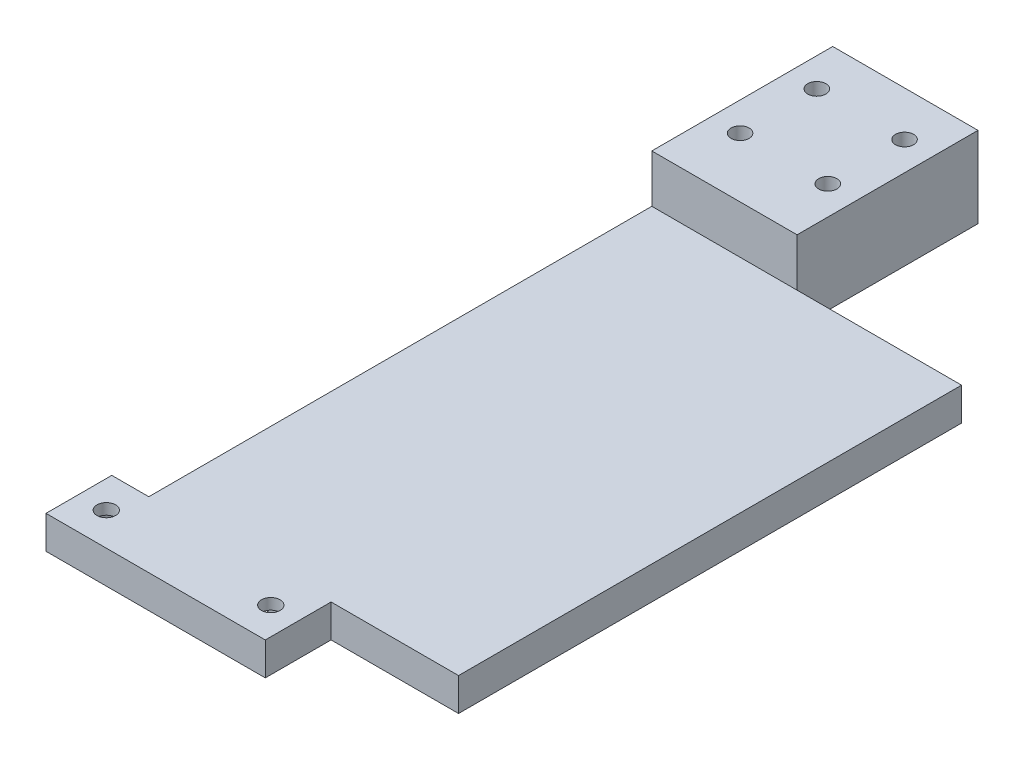
ISO-10303-21;
HEADER;
FILE_DESCRIPTION(('STEP AP214'),'2;1');
FILE_NAME('part.step','',(''),(''),'','','');
FILE_SCHEMA(('AUTOMOTIVE_DESIGN { 1 0 10303 214 1 1 1 1 }'));
ENDSEC;
DATA;
#1=APPLICATION_CONTEXT('core data for automotive mechanical design processes');
#2=APPLICATION_PROTOCOL_DEFINITION('international standard','automotive_design',2000,#1);
#3=PRODUCT_CONTEXT('',#1,'mechanical');
#4=PRODUCT('Part','Part','',(#3));
#5=PRODUCT_RELATED_PRODUCT_CATEGORY('part','',(#4));
#6=PRODUCT_DEFINITION_FORMATION('','',#4);
#7=PRODUCT_DEFINITION_CONTEXT('part definition',#1,'design');
#8=PRODUCT_DEFINITION('design','',#6,#7);
#9=PRODUCT_DEFINITION_SHAPE('','',#8);
#10=(LENGTH_UNIT() NAMED_UNIT(*) SI_UNIT(.MILLI.,.METRE.));
#11=(NAMED_UNIT(*) PLANE_ANGLE_UNIT() SI_UNIT($,.RADIAN.));
#12=(NAMED_UNIT(*) SI_UNIT($,.STERADIAN.) SOLID_ANGLE_UNIT());
#13=UNCERTAINTY_MEASURE_WITH_UNIT(LENGTH_MEASURE(1.E-05),#10,'distance_accuracy_value','');
#14=(GEOMETRIC_REPRESENTATION_CONTEXT(3) GLOBAL_UNCERTAINTY_ASSIGNED_CONTEXT((#13)) GLOBAL_UNIT_ASSIGNED_CONTEXT((#10,
#11,#12)) REPRESENTATION_CONTEXT('',''));
#15=CARTESIAN_POINT('',(0.,0.,0.));
#16=DIRECTION('',(0.,0.,1.));
#17=DIRECTION('',(1.,0.,0.));
#18=AXIS2_PLACEMENT_3D('',#15,#16,#17);
#19=CARTESIAN_POINT('',(13.25,14.75,-3.3));
#20=DIRECTION('',(-1.,0.,0.));
#21=DIRECTION('',(0.,0.,1.));
#22=AXIS2_PLACEMENT_3D('',#19,#20,#21);
#23=PLANE('',#22);
#24=DIRECTION('',(0.,1.,0.));
#25=VECTOR('',#24,1.);
#26=CARTESIAN_POINT('',(13.25,6.,0.));
#27=LINE('',#26,#25);
#28=CARTESIAN_POINT('',(13.25,0.,0.));
#29=VERTEX_POINT('',#28);
#30=CARTESIAN_POINT('',(13.25,6.,0.));
#31=VERTEX_POINT('',#30);
#32=EDGE_CURVE('E56',#29,#31,#27,.T.);
#33=ORIENTED_EDGE('',*,*,#32,.F.);
#34=DIRECTION('',(0.,0.,-1.));
#35=VECTOR('',#34,1.);
#36=CARTESIAN_POINT('',(13.25,0.,-3.3));
#37=LINE('',#36,#35);
#38=CARTESIAN_POINT('',(13.25,0.,-33.));
#39=VERTEX_POINT('',#38);
#40=EDGE_CURVE('E341',#29,#39,#37,.T.);
#41=ORIENTED_EDGE('',*,*,#40,.T.);
#42=DIRECTION('',(0.,-1.,0.));
#43=VECTOR('',#42,1.);
#44=CARTESIAN_POINT('',(13.25,14.75,-33.));
#45=LINE('',#44,#43);
#46=CARTESIAN_POINT('',(13.25,14.75,-33.));
#47=VERTEX_POINT('',#46);
#48=EDGE_CURVE('E347',#47,#39,#45,.T.);
#49=ORIENTED_EDGE('',*,*,#48,.F.);
#50=DIRECTION('',(0.,0.,-1.));
#51=VECTOR('',#50,1.);
#52=CARTESIAN_POINT('',(13.25,14.75,-3.3));
#53=LINE('',#52,#51);
#54=CARTESIAN_POINT('',(13.25,14.75,0.));
#55=VERTEX_POINT('',#54);
#56=EDGE_CURVE('E345',#55,#47,#53,.T.);
#57=ORIENTED_EDGE('',*,*,#56,.F.);
#58=DIRECTION('',(0.,-1.,0.));
#59=VECTOR('',#58,1.);
#60=CARTESIAN_POINT('',(13.25,14.75,0.));
#61=LINE('',#60,#59);
#62=EDGE_CURVE('E355',#55,#31,#61,.T.);
#63=ORIENTED_EDGE('',*,*,#62,.T.);
#64=EDGE_LOOP('',(#33,#41,#49,#57,#63));
#65=FACE_BOUND('',#64,.T.);
#66=ADVANCED_FACE('F39',(#65),#23,.F.);
#67=CARTESIAN_POINT('',(15.0000000000001,0.,97.7499999999999));
#68=DIRECTION('',(0.,1.,0.));
#69=DIRECTION('',(0.,0.,1.));
#70=AXIS2_PLACEMENT_3D('',#67,#68,#69);
#71=CYLINDRICAL_SURFACE('',#70,1.70000000000001);
#72=CARTESIAN_POINT('',(15.0000000000001,6.,97.7499999999999));
#73=DIRECTION('',(0.,1.,0.));
#74=DIRECTION('',(0.,0.,1.));
#75=AXIS2_PLACEMENT_3D('',#72,#73,#74);
#76=CIRCLE('',#75,1.70000000000001);
#77=CARTESIAN_POINT('',(15.0000000000001,6.,99.45));
#78=VERTEX_POINT('',#77);
#79=EDGE_CURVE('E282',#78,#78,#76,.T.);
#80=ORIENTED_EDGE('',*,*,#79,.T.);
#81=EDGE_LOOP('',(#80));
#82=FACE_BOUND('',#81,.T.);
#83=CARTESIAN_POINT('',(15.0000000000001,4.,97.7499999999999));
#84=DIRECTION('',(0.,-1.,0.));
#85=DIRECTION('',(0.,0.,-1.));
#86=AXIS2_PLACEMENT_3D('',#83,#84,#85);
#87=CIRCLE('',#86,1.70000000000001);
#88=CARTESIAN_POINT('',(15.0000000000001,4.,96.0499999999999));
#89=VERTEX_POINT('',#88);
#90=EDGE_CURVE('E237',#89,#89,#87,.F.);
#91=ORIENTED_EDGE('',*,*,#90,.F.);
#92=EDGE_LOOP('',(#91));
#93=FACE_BOUND('',#92,.T.);
#94=ADVANCED_FACE('F390',(#82,#93),#71,.F.);
#95=CARTESIAN_POINT('',(-14.9999999999999,0.,97.7499999999999));
#96=DIRECTION('',(0.,1.,0.));
#97=DIRECTION('',(0.,0.,1.));
#98=AXIS2_PLACEMENT_3D('',#95,#96,#97);
#99=CYLINDRICAL_SURFACE('',#98,1.70000000000001);
#100=CARTESIAN_POINT('',(-14.9999999999999,6.,97.7499999999999));
#101=DIRECTION('',(0.,1.,0.));
#102=DIRECTION('',(0.,0.,1.));
#103=AXIS2_PLACEMENT_3D('',#100,#101,#102);
#104=CIRCLE('',#103,1.70000000000001);
#105=CARTESIAN_POINT('',(-14.9999999999999,6.,99.45));
#106=VERTEX_POINT('',#105);
#107=EDGE_CURVE('E283',#106,#106,#104,.T.);
#108=ORIENTED_EDGE('',*,*,#107,.T.);
#109=EDGE_LOOP('',(#108));
#110=FACE_BOUND('',#109,.T.);
#111=CARTESIAN_POINT('',(-14.9999999999999,4.,97.7499999999999));
#112=DIRECTION('',(0.,-1.,0.));
#113=DIRECTION('',(0.,0.,-1.));
#114=AXIS2_PLACEMENT_3D('',#111,#112,#113);
#115=CIRCLE('',#114,1.70000000000001);
#116=CARTESIAN_POINT('',(-14.9999999999999,4.,96.0499999999999));
#117=VERTEX_POINT('',#116);
#118=EDGE_CURVE('E43',#117,#117,#115,.F.);
#119=ORIENTED_EDGE('',*,*,#118,.F.);
#120=EDGE_LOOP('',(#119));
#121=FACE_BOUND('',#120,.T.);
#122=ADVANCED_FACE('F396',(#110,#121),#99,.F.);
#123=CARTESIAN_POINT('',(-13.25,14.75,-3.3));
#124=DIRECTION('',(1.,0.,0.));
#125=DIRECTION('',(0.,0.,-1.));
#126=AXIS2_PLACEMENT_3D('',#123,#124,#125);
#127=PLANE('',#126);
#128=DIRECTION('',(0.,-1.,0.));
#129=VECTOR('',#128,1.);
#130=CARTESIAN_POINT('',(-13.2499999999999,14.75,91.75));
#131=LINE('',#130,#129);
#132=CARTESIAN_POINT('',(-13.25,6.,91.75));
#133=VERTEX_POINT('',#132);
#134=CARTESIAN_POINT('',(-13.2499999999999,0.,91.75));
#135=VERTEX_POINT('',#134);
#136=EDGE_CURVE('E312',#133,#135,#131,.T.);
#137=ORIENTED_EDGE('',*,*,#136,.F.);
#138=DIRECTION('',(0.,0.,-1.));
#139=VECTOR('',#138,1.);
#140=CARTESIAN_POINT('',(-13.25,6.,103.75));
#141=LINE('',#140,#139);
#142=CARTESIAN_POINT('',(-13.25,6.,0.));
#143=VERTEX_POINT('',#142);
#144=EDGE_CURVE('E320',#133,#143,#141,.T.);
#145=ORIENTED_EDGE('',*,*,#144,.T.);
#146=DIRECTION('',(0.,-1.,0.));
#147=VECTOR('',#146,1.);
#148=CARTESIAN_POINT('',(-13.25,14.75,0.));
#149=LINE('',#148,#147);
#150=CARTESIAN_POINT('',(-13.25,14.75,0.));
#151=VERTEX_POINT('',#150);
#152=EDGE_CURVE('E48',#151,#143,#149,.T.);
#153=ORIENTED_EDGE('',*,*,#152,.F.);
#154=DIRECTION('',(0.,0.,1.));
#155=VECTOR('',#154,1.);
#156=CARTESIAN_POINT('',(-13.25,14.75,-33.));
#157=LINE('',#156,#155);
#158=CARTESIAN_POINT('',(-13.25,14.75,-33.));
#159=VERTEX_POINT('',#158);
#160=EDGE_CURVE('E340',#159,#151,#157,.T.);
#161=ORIENTED_EDGE('',*,*,#160,.F.);
#162=DIRECTION('',(0.,-1.,0.));
#163=VECTOR('',#162,1.);
#164=CARTESIAN_POINT('',(-13.25,14.75,-33.));
#165=LINE('',#164,#163);
#166=CARTESIAN_POINT('',(-13.25,0.,-33.));
#167=VERTEX_POINT('',#166);
#168=EDGE_CURVE('E11',#159,#167,#165,.T.);
#169=ORIENTED_EDGE('',*,*,#168,.T.);
#170=DIRECTION('',(0.,0.,1.));
#171=VECTOR('',#170,1.);
#172=CARTESIAN_POINT('',(-13.25,0.,-3.3));
#173=LINE('',#172,#171);
#174=EDGE_CURVE('E350',#167,#135,#173,.T.);
#175=ORIENTED_EDGE('',*,*,#174,.T.);
#176=EDGE_LOOP('',(#137,#145,#153,#161,#169,#175));
#177=FACE_BOUND('',#176,.T.);
#178=ADVANCED_FACE('F383',(#177),#127,.F.);
#179=CARTESIAN_POINT('',(-13.25,14.75,0.));
#180=DIRECTION('',(0.,0.,-1.));
#181=DIRECTION('',(-1.,0.,0.));
#182=AXIS2_PLACEMENT_3D('',#179,#180,#181);
#183=PLANE('',#182);
#184=DIRECTION('',(-1.,0.,0.));
#185=VECTOR('',#184,1.);
#186=CARTESIAN_POINT('',(-13.25,6.,0.));
#187=LINE('',#186,#185);
#188=EDGE_CURVE('E315',#31,#143,#187,.T.);
#189=ORIENTED_EDGE('',*,*,#188,.F.);
#190=ORIENTED_EDGE('',*,*,#62,.F.);
#191=DIRECTION('',(1.,0.,0.));
#192=VECTOR('',#191,1.);
#193=CARTESIAN_POINT('',(-13.25,14.75,0.));
#194=LINE('',#193,#192);
#195=EDGE_CURVE('E343',#151,#55,#194,.T.);
#196=ORIENTED_EDGE('',*,*,#195,.F.);
#197=ORIENTED_EDGE('',*,*,#152,.T.);
#198=EDGE_LOOP('',(#189,#190,#196,#197));
#199=FACE_BOUND('',#198,.T.);
#200=ADVANCED_FACE('F374',(#199),#183,.F.);
#201=CARTESIAN_POINT('',(0.,14.75,0.));
#202=DIRECTION('',(0.,1.,0.));
#203=DIRECTION('',(0.,0.,1.));
#204=AXIS2_PLACEMENT_3D('',#201,#202,#203);
#205=PLANE('',#204);
#206=CARTESIAN_POINT('',(-8.00000000000001,14.75,-24.85));
#207=DIRECTION('',(0.,1.,0.));
#208=DIRECTION('',(0.,0.,1.));
#209=AXIS2_PLACEMENT_3D('',#206,#207,#208);
#210=CIRCLE('',#209,1.65);
#211=CARTESIAN_POINT('',(-8.00000000000001,14.75,-23.2));
#212=VERTEX_POINT('',#211);
#213=EDGE_CURVE('E327',#212,#212,#210,.T.);
#214=ORIENTED_EDGE('',*,*,#213,.F.);
#215=EDGE_LOOP('',(#214));
#216=FACE_BOUND('',#215,.T.);
#217=CARTESIAN_POINT('',(7.99999999999999,14.75,-10.85));
#218=DIRECTION('',(0.,1.,0.));
#219=DIRECTION('',(0.,0.,1.));
#220=AXIS2_PLACEMENT_3D('',#217,#218,#219);
#221=CIRCLE('',#220,1.65);
#222=CARTESIAN_POINT('',(7.99999999999999,14.75,-9.2));
#223=VERTEX_POINT('',#222);
#224=EDGE_CURVE('E333',#223,#223,#221,.T.);
#225=ORIENTED_EDGE('',*,*,#224,.F.);
#226=EDGE_LOOP('',(#225));
#227=FACE_BOUND('',#226,.T.);
#228=DIRECTION('',(-1.,0.,0.));
#229=VECTOR('',#228,1.);
#230=CARTESIAN_POINT('',(13.25,14.75,-33.));
#231=LINE('',#230,#229);
#232=EDGE_CURVE('E337',#47,#159,#231,.T.);
#233=ORIENTED_EDGE('',*,*,#232,.T.);
#234=ORIENTED_EDGE('',*,*,#160,.T.);
#235=ORIENTED_EDGE('',*,*,#195,.T.);
#236=ORIENTED_EDGE('',*,*,#56,.T.);
#237=EDGE_LOOP('',(#233,#234,#235,#236));
#238=FACE_BOUND('',#237,.T.);
#239=CARTESIAN_POINT('',(7.99999999999999,14.75,-24.85));
#240=DIRECTION('',(0.,1.,0.));
#241=DIRECTION('',(0.,0.,1.));
#242=AXIS2_PLACEMENT_3D('',#239,#240,#241);
#243=CIRCLE('',#242,1.65);
#244=CARTESIAN_POINT('',(7.99999999999999,14.75,-23.2));
#245=VERTEX_POINT('',#244);
#246=EDGE_CURVE('E330',#245,#245,#243,.T.);
#247=ORIENTED_EDGE('',*,*,#246,.F.);
#248=EDGE_LOOP('',(#247));
#249=FACE_BOUND('',#248,.T.);
#250=CARTESIAN_POINT('',(-8.00000000000001,14.75,-10.85));
#251=DIRECTION('',(0.,1.,0.));
#252=DIRECTION('',(0.,0.,1.));
#253=AXIS2_PLACEMENT_3D('',#250,#251,#252);
#254=CIRCLE('',#253,1.65);
#255=CARTESIAN_POINT('',(-8.00000000000001,14.75,-9.2));
#256=VERTEX_POINT('',#255);
#257=EDGE_CURVE('E324',#256,#256,#254,.T.);
#258=ORIENTED_EDGE('',*,*,#257,.F.);
#259=EDGE_LOOP('',(#258));
#260=FACE_BOUND('',#259,.T.);
#261=ADVANCED_FACE('F372',(#216,#227,#238,#249,#260),#205,.T.);
#262=CARTESIAN_POINT('',(0.,0.,0.));
#263=DIRECTION('',(0.,1.,0.));
#264=DIRECTION('',(0.,0.,1.));
#265=AXIS2_PLACEMENT_3D('',#262,#263,#264);
#266=PLANE('',#265);
#267=ORIENTED_EDGE('',*,*,#40,.F.);
#268=DIRECTION('',(-1.,0.,0.));
#269=VECTOR('',#268,1.);
#270=CARTESIAN_POINT('',(43.25,0.,0.));
#271=LINE('',#270,#269);
#272=CARTESIAN_POINT('',(43.25,0.,0.));
#273=VERTEX_POINT('',#272);
#274=EDGE_CURVE('E184',#273,#29,#271,.T.);
#275=ORIENTED_EDGE('',*,*,#274,.F.);
#276=DIRECTION('',(0.,0.,-1.));
#277=VECTOR('',#276,1.);
#278=CARTESIAN_POINT('',(43.25,0.,91.75));
#279=LINE('',#278,#277);
#280=CARTESIAN_POINT('',(43.25,0.,91.75));
#281=VERTEX_POINT('',#280);
#282=EDGE_CURVE('E176',#281,#273,#279,.T.);
#283=ORIENTED_EDGE('',*,*,#282,.F.);
#284=DIRECTION('',(-1.,0.,0.));
#285=VECTOR('',#284,1.);
#286=CARTESIAN_POINT('',(43.25,0.,91.75));
#287=LINE('',#286,#285);
#288=CARTESIAN_POINT('',(20.0000000000001,0.,91.75));
#289=VERTEX_POINT('',#288);
#290=EDGE_CURVE('E182',#281,#289,#287,.T.);
#291=ORIENTED_EDGE('',*,*,#290,.T.);
#292=DIRECTION('',(0.,0.,1.));
#293=VECTOR('',#292,1.);
#294=CARTESIAN_POINT('',(20.0000000000001,0.,103.75));
#295=LINE('',#294,#293);
#296=CARTESIAN_POINT('',(20.0000000000001,0.,103.75));
#297=VERTEX_POINT('',#296);
#298=EDGE_CURVE('E294',#289,#297,#295,.T.);
#299=ORIENTED_EDGE('',*,*,#298,.T.);
#300=DIRECTION('',(1.,0.,0.));
#301=VECTOR('',#300,1.);
#302=CARTESIAN_POINT('',(-13.25,0.,103.75));
#303=LINE('',#302,#301);
#304=CARTESIAN_POINT('',(-19.9999999999999,0.,103.75));
#305=VERTEX_POINT('',#304);
#306=EDGE_CURVE('E316',#305,#297,#303,.T.);
#307=ORIENTED_EDGE('',*,*,#306,.F.);
#308=DIRECTION('',(0.,0.,1.));
#309=VECTOR('',#308,1.);
#310=CARTESIAN_POINT('',(-19.9999999999999,0.,103.75));
#311=LINE('',#310,#309);
#312=CARTESIAN_POINT('',(-19.9999999999999,0.,91.75));
#313=VERTEX_POINT('',#312);
#314=EDGE_CURVE('E303',#313,#305,#311,.T.);
#315=ORIENTED_EDGE('',*,*,#314,.F.);
#316=DIRECTION('',(1.,0.,0.));
#317=VECTOR('',#316,1.);
#318=CARTESIAN_POINT('',(-19.9999999999999,0.,91.75));
#319=LINE('',#318,#317);
#320=EDGE_CURVE('E306',#313,#135,#319,.T.);
#321=ORIENTED_EDGE('',*,*,#320,.T.);
#322=ORIENTED_EDGE('',*,*,#174,.F.);
#323=DIRECTION('',(-1.,0.,0.));
#324=VECTOR('',#323,1.);
#325=CARTESIAN_POINT('',(13.25,0.,-33.));
#326=LINE('',#325,#324);
#327=EDGE_CURVE('E336',#39,#167,#326,.T.);
#328=ORIENTED_EDGE('',*,*,#327,.F.);
#329=EDGE_LOOP('',(#267,#275,#283,#291,#299,#307,#315,#321,#322,#328));
#330=FACE_BOUND('',#329,.T.);
#331=DIRECTION('',(1.,0.,0.));
#332=VECTOR('',#331,1.);
#333=CARTESIAN_POINT('',(-18.6999999999999,0.,93.0499999999999));
#334=LINE('',#333,#332);
#335=CARTESIAN_POINT('',(-18.6999999999999,0.,93.0499999999999));
#336=VERTEX_POINT('',#335);
#337=CARTESIAN_POINT('',(17.7727599325653,0.,93.0499999999999));
#338=VERTEX_POINT('',#337);
#339=EDGE_CURVE('E203',#336,#338,#334,.T.);
#340=ORIENTED_EDGE('',*,*,#339,.F.);
#341=DIRECTION('',(0.,0.,-1.));
#342=VECTOR('',#341,1.);
#343=CARTESIAN_POINT('',(-18.6999999999999,0.,102.45));
#344=LINE('',#343,#342);
#345=CARTESIAN_POINT('',(-18.6999999999999,0.,102.45));
#346=VERTEX_POINT('',#345);
#347=EDGE_CURVE('E64',#346,#336,#344,.T.);
#348=ORIENTED_EDGE('',*,*,#347,.F.);
#349=DIRECTION('',(-1.,0.,0.));
#350=VECTOR('',#349,1.);
#351=CARTESIAN_POINT('',(-18.6999999999999,0.,102.45));
#352=LINE('',#351,#350);
#353=CARTESIAN_POINT('',(17.7727599325653,0.,102.45));
#354=VERTEX_POINT('',#353);
#355=EDGE_CURVE('E213',#354,#346,#352,.T.);
#356=ORIENTED_EDGE('',*,*,#355,.F.);
#357=DIRECTION('',(0.,0.,1.));
#358=VECTOR('',#357,1.);
#359=CARTESIAN_POINT('',(17.7727599325653,0.,102.45));
#360=LINE('',#359,#358);
#361=EDGE_CURVE('E225',#338,#354,#360,.T.);
#362=ORIENTED_EDGE('',*,*,#361,.F.);
#363=EDGE_LOOP('',(#340,#348,#356,#362));
#364=FACE_BOUND('',#363,.T.);
#365=DIRECTION('',(1.,0.,0.));
#366=VECTOR('',#365,1.);
#367=CARTESIAN_POINT('',(-11.65,0.,-29.5));
#368=LINE('',#367,#366);
#369=CARTESIAN_POINT('',(-11.65,0.,-29.5));
#370=VERTEX_POINT('',#369);
#371=CARTESIAN_POINT('',(11.65,0.,-29.5));
#372=VERTEX_POINT('',#371);
#373=EDGE_CURVE('E256',#370,#372,#368,.T.);
#374=ORIENTED_EDGE('',*,*,#373,.F.);
#375=DIRECTION('',(0.,0.,-1.));
#376=VECTOR('',#375,1.);
#377=CARTESIAN_POINT('',(-11.65,0.,-29.5));
#378=LINE('',#377,#376);
#379=CARTESIAN_POINT('',(-11.65,0.,-6.2));
#380=VERTEX_POINT('',#379);
#381=EDGE_CURVE('E240',#380,#370,#378,.T.);
#382=ORIENTED_EDGE('',*,*,#381,.F.);
#383=DIRECTION('',(-1.,0.,0.));
#384=VECTOR('',#383,1.);
#385=CARTESIAN_POINT('',(-11.65,0.,-6.2));
#386=LINE('',#385,#384);
#387=CARTESIAN_POINT('',(11.65,0.,-6.2));
#388=VERTEX_POINT('',#387);
#389=EDGE_CURVE('E245',#388,#380,#386,.T.);
#390=ORIENTED_EDGE('',*,*,#389,.F.);
#391=DIRECTION('',(0.,0.,1.));
#392=VECTOR('',#391,1.);
#393=CARTESIAN_POINT('',(11.65,0.,-29.5));
#394=LINE('',#393,#392);
#395=EDGE_CURVE('E259',#372,#388,#394,.T.);
#396=ORIENTED_EDGE('',*,*,#395,.F.);
#397=EDGE_LOOP('',(#374,#382,#390,#396));
#398=FACE_BOUND('',#397,.T.);
#399=ADVANCED_FACE('F178',(#330,#364,#398),#266,.F.);
#400=CARTESIAN_POINT('',(13.25,14.75,-33.));
#401=DIRECTION('',(0.,0.,1.));
#402=DIRECTION('',(1.,0.,0.));
#403=AXIS2_PLACEMENT_3D('',#400,#401,#402);
#404=PLANE('',#403);
#405=ORIENTED_EDGE('',*,*,#327,.T.);
#406=ORIENTED_EDGE('',*,*,#168,.F.);
#407=ORIENTED_EDGE('',*,*,#232,.F.);
#408=ORIENTED_EDGE('',*,*,#48,.T.);
#409=EDGE_LOOP('',(#405,#406,#407,#408));
#410=FACE_BOUND('',#409,.T.);
#411=ADVANCED_FACE('F41',(#410),#404,.F.);
#412=CARTESIAN_POINT('',(7.99999999999999,14.75,-10.85));
#413=DIRECTION('',(0.,-1.,0.));
#414=DIRECTION('',(0.,0.,-1.));
#415=AXIS2_PLACEMENT_3D('',#412,#413,#414);
#416=CYLINDRICAL_SURFACE('',#415,1.65);
#417=CARTESIAN_POINT('',(7.99999999999999,4.,-10.85));
#418=DIRECTION('',(0.,1.,0.));
#419=DIRECTION('',(0.,0.,1.));
#420=AXIS2_PLACEMENT_3D('',#417,#418,#419);
#421=CIRCLE('',#420,1.65);
#422=CARTESIAN_POINT('',(7.99999999999999,4.,-9.2));
#423=VERTEX_POINT('',#422);
#424=EDGE_CURVE('E279',#423,#423,#421,.T.);
#425=ORIENTED_EDGE('',*,*,#424,.F.);
#426=EDGE_LOOP('',(#425));
#427=FACE_BOUND('',#426,.T.);
#428=ORIENTED_EDGE('',*,*,#224,.T.);
#429=EDGE_LOOP('',(#428));
#430=FACE_BOUND('',#429,.T.);
#431=ADVANCED_FACE('F502',(#427,#430),#416,.F.);
#432=CARTESIAN_POINT('',(7.99999999999999,14.75,-24.85));
#433=DIRECTION('',(0.,-1.,0.));
#434=DIRECTION('',(0.,0.,-1.));
#435=AXIS2_PLACEMENT_3D('',#432,#433,#434);
#436=CYLINDRICAL_SURFACE('',#435,1.65);
#437=CARTESIAN_POINT('',(7.99999999999999,4.,-24.85));
#438=DIRECTION('',(0.,1.,0.));
#439=DIRECTION('',(0.,0.,1.));
#440=AXIS2_PLACEMENT_3D('',#437,#438,#439);
#441=CIRCLE('',#440,1.65);
#442=CARTESIAN_POINT('',(7.99999999999999,4.,-23.2));
#443=VERTEX_POINT('',#442);
#444=EDGE_CURVE('E276',#443,#443,#441,.T.);
#445=ORIENTED_EDGE('',*,*,#444,.F.);
#446=EDGE_LOOP('',(#445));
#447=FACE_BOUND('',#446,.T.);
#448=ORIENTED_EDGE('',*,*,#246,.T.);
#449=EDGE_LOOP('',(#448));
#450=FACE_BOUND('',#449,.T.);
#451=ADVANCED_FACE('F499',(#447,#450),#436,.F.);
#452=CARTESIAN_POINT('',(-8.00000000000001,14.75,-24.85));
#453=DIRECTION('',(0.,-1.,0.));
#454=DIRECTION('',(0.,0.,-1.));
#455=AXIS2_PLACEMENT_3D('',#452,#453,#454);
#456=CYLINDRICAL_SURFACE('',#455,1.65);
#457=CARTESIAN_POINT('',(-8.00000000000001,4.,-24.85));
#458=DIRECTION('',(0.,1.,0.));
#459=DIRECTION('',(0.,0.,1.));
#460=AXIS2_PLACEMENT_3D('',#457,#458,#459);
#461=CIRCLE('',#460,1.65);
#462=CARTESIAN_POINT('',(-8.00000000000001,4.,-23.2));
#463=VERTEX_POINT('',#462);
#464=EDGE_CURVE('E273',#463,#463,#461,.T.);
#465=ORIENTED_EDGE('',*,*,#464,.F.);
#466=EDGE_LOOP('',(#465));
#467=FACE_BOUND('',#466,.T.);
#468=ORIENTED_EDGE('',*,*,#213,.T.);
#469=EDGE_LOOP('',(#468));
#470=FACE_BOUND('',#469,.T.);
#471=ADVANCED_FACE('F368',(#467,#470),#456,.F.);
#472=CARTESIAN_POINT('',(-8.00000000000001,14.75,-10.85));
#473=DIRECTION('',(0.,-1.,0.));
#474=DIRECTION('',(0.,0.,-1.));
#475=AXIS2_PLACEMENT_3D('',#472,#473,#474);
#476=CYLINDRICAL_SURFACE('',#475,1.65);
#477=CARTESIAN_POINT('',(-8.00000000000001,4.,-10.85));
#478=DIRECTION('',(0.,1.,0.));
#479=DIRECTION('',(0.,0.,1.));
#480=AXIS2_PLACEMENT_3D('',#477,#478,#479);
#481=CIRCLE('',#480,1.65);
#482=CARTESIAN_POINT('',(-8.00000000000001,4.,-9.2));
#483=VERTEX_POINT('',#482);
#484=EDGE_CURVE('E266',#483,#483,#481,.T.);
#485=ORIENTED_EDGE('',*,*,#484,.F.);
#486=EDGE_LOOP('',(#485));
#487=FACE_BOUND('',#486,.T.);
#488=ORIENTED_EDGE('',*,*,#257,.T.);
#489=EDGE_LOOP('',(#488));
#490=FACE_BOUND('',#489,.T.);
#491=ADVANCED_FACE('F364',(#487,#490),#476,.F.);
#492=CARTESIAN_POINT('',(-13.25,6.,103.75));
#493=DIRECTION('',(0.,-1.,0.));
#494=DIRECTION('',(0.,0.,-1.));
#495=AXIS2_PLACEMENT_3D('',#492,#493,#494);
#496=PLANE('',#495);
#497=DIRECTION('',(-1.,0.,0.));
#498=VECTOR('',#497,1.);
#499=CARTESIAN_POINT('',(43.25,6.,0.));
#500=LINE('',#499,#498);
#501=CARTESIAN_POINT('',(43.25,6.,0.));
#502=VERTEX_POINT('',#501);
#503=EDGE_CURVE('E205',#502,#31,#500,.T.);
#504=ORIENTED_EDGE('',*,*,#503,.T.);
#505=ORIENTED_EDGE('',*,*,#188,.T.);
#506=ORIENTED_EDGE('',*,*,#144,.F.);
#507=DIRECTION('',(1.,0.,0.));
#508=VECTOR('',#507,1.);
#509=CARTESIAN_POINT('',(-19.9999999999999,6.,91.75));
#510=LINE('',#509,#508);
#511=CARTESIAN_POINT('',(-19.9999999999999,6.,91.75));
#512=VERTEX_POINT('',#511);
#513=EDGE_CURVE('E309',#512,#133,#510,.T.);
#514=ORIENTED_EDGE('',*,*,#513,.F.);
#515=DIRECTION('',(0.,0.,-1.));
#516=VECTOR('',#515,1.);
#517=CARTESIAN_POINT('',(-19.9999999999999,6.,103.75));
#518=LINE('',#517,#516);
#519=CARTESIAN_POINT('',(-19.9999999999999,6.,103.75));
#520=VERTEX_POINT('',#519);
#521=EDGE_CURVE('E299',#520,#512,#518,.T.);
#522=ORIENTED_EDGE('',*,*,#521,.F.);
#523=DIRECTION('',(-1.,0.,0.));
#524=VECTOR('',#523,1.);
#525=CARTESIAN_POINT('',(-13.25,6.,103.75));
#526=LINE('',#525,#524);
#527=CARTESIAN_POINT('',(20.0000000000001,6.,103.75));
#528=VERTEX_POINT('',#527);
#529=EDGE_CURVE('E318',#528,#520,#526,.T.);
#530=ORIENTED_EDGE('',*,*,#529,.F.);
#531=DIRECTION('',(0.,0.,-1.));
#532=VECTOR('',#531,1.);
#533=CARTESIAN_POINT('',(20.0000000000001,6.,103.75));
#534=LINE('',#533,#532);
#535=CARTESIAN_POINT('',(20.0000000000001,6.,91.75));
#536=VERTEX_POINT('',#535);
#537=EDGE_CURVE('E291',#528,#536,#534,.T.);
#538=ORIENTED_EDGE('',*,*,#537,.T.);
#539=DIRECTION('',(-1.,0.,0.));
#540=VECTOR('',#539,1.);
#541=CARTESIAN_POINT('',(43.25,6.,91.75));
#542=LINE('',#541,#540);
#543=CARTESIAN_POINT('',(43.25,6.,91.75));
#544=VERTEX_POINT('',#543);
#545=EDGE_CURVE('E438',#544,#536,#542,.T.);
#546=ORIENTED_EDGE('',*,*,#545,.F.);
#547=DIRECTION('',(0.,0.,1.));
#548=VECTOR('',#547,1.);
#549=CARTESIAN_POINT('',(43.25,6.,91.75));
#550=LINE('',#549,#548);
#551=EDGE_CURVE('E193',#502,#544,#550,.T.);
#552=ORIENTED_EDGE('',*,*,#551,.F.);
#553=EDGE_LOOP('',(#504,#505,#506,#514,#522,#530,#538,#546,#552));
#554=FACE_BOUND('',#553,.T.);
#555=ORIENTED_EDGE('',*,*,#107,.F.);
#556=EDGE_LOOP('',(#555));
#557=FACE_BOUND('',#556,.T.);
#558=ORIENTED_EDGE('',*,*,#79,.F.);
#559=EDGE_LOOP('',(#558));
#560=FACE_BOUND('',#559,.T.);
#561=ADVANCED_FACE('F367',(#554,#557,#560),#496,.F.);
#562=CARTESIAN_POINT('',(0.,0.,103.75));
#563=DIRECTION('',(0.,0.,-1.));
#564=DIRECTION('',(-1.,0.,0.));
#565=AXIS2_PLACEMENT_3D('',#562,#563,#564);
#566=PLANE('',#565);
#567=ORIENTED_EDGE('',*,*,#529,.T.);
#568=DIRECTION('',(0.,1.,0.));
#569=VECTOR('',#568,1.);
#570=CARTESIAN_POINT('',(-19.9999999999999,0.,103.75));
#571=LINE('',#570,#569);
#572=EDGE_CURVE('E296',#305,#520,#571,.T.);
#573=ORIENTED_EDGE('',*,*,#572,.F.);
#574=ORIENTED_EDGE('',*,*,#306,.T.);
#575=DIRECTION('',(0.,1.,0.));
#576=VECTOR('',#575,1.);
#577=CARTESIAN_POINT('',(20.0000000000001,0.,103.75));
#578=LINE('',#577,#576);
#579=EDGE_CURVE('E286',#297,#528,#578,.T.);
#580=ORIENTED_EDGE('',*,*,#579,.T.);
#581=EDGE_LOOP('',(#567,#573,#574,#580));
#582=FACE_BOUND('',#581,.T.);
#583=ADVANCED_FACE('F427',(#582),#566,.F.);
#584=CARTESIAN_POINT('',(20.,0.,0.));
#585=DIRECTION('',(-1.,0.,0.));
#586=DIRECTION('',(0.,0.,1.));
#587=AXIS2_PLACEMENT_3D('',#584,#585,#586);
#588=PLANE('',#587);
#589=ORIENTED_EDGE('',*,*,#579,.F.);
#590=ORIENTED_EDGE('',*,*,#298,.F.);
#591=DIRECTION('',(0.,-1.,0.));
#592=VECTOR('',#591,1.);
#593=CARTESIAN_POINT('',(20.0000000000001,0.,91.75));
#594=LINE('',#593,#592);
#595=EDGE_CURVE('E201',#536,#289,#594,.T.);
#596=ORIENTED_EDGE('',*,*,#595,.F.);
#597=ORIENTED_EDGE('',*,*,#537,.F.);
#598=EDGE_LOOP('',(#589,#590,#596,#597));
#599=FACE_BOUND('',#598,.T.);
#600=ADVANCED_FACE('F426',(#599),#588,.F.);
#601=CARTESIAN_POINT('',(-19.9999999999999,0.,91.75));
#602=DIRECTION('',(0.,0.,1.));
#603=DIRECTION('',(1.,0.,0.));
#604=AXIS2_PLACEMENT_3D('',#601,#602,#603);
#605=PLANE('',#604);
#606=ORIENTED_EDGE('',*,*,#513,.T.);
#607=ORIENTED_EDGE('',*,*,#136,.T.);
#608=ORIENTED_EDGE('',*,*,#320,.F.);
#609=DIRECTION('',(0.,-1.,0.));
#610=VECTOR('',#609,1.);
#611=CARTESIAN_POINT('',(-19.9999999999999,0.,91.75));
#612=LINE('',#611,#610);
#613=EDGE_CURVE('E301',#512,#313,#612,.T.);
#614=ORIENTED_EDGE('',*,*,#613,.F.);
#615=EDGE_LOOP('',(#606,#607,#608,#614));
#616=FACE_BOUND('',#615,.T.);
#617=ADVANCED_FACE('F417',(#616),#605,.F.);
#618=CARTESIAN_POINT('',(-20.,0.,0.));
#619=DIRECTION('',(-1.,0.,0.));
#620=DIRECTION('',(0.,0.,1.));
#621=AXIS2_PLACEMENT_3D('',#618,#619,#620);
#622=PLANE('',#621);
#623=ORIENTED_EDGE('',*,*,#572,.T.);
#624=ORIENTED_EDGE('',*,*,#521,.T.);
#625=ORIENTED_EDGE('',*,*,#613,.T.);
#626=ORIENTED_EDGE('',*,*,#314,.T.);
#627=EDGE_LOOP('',(#623,#624,#625,#626));
#628=FACE_BOUND('',#627,.T.);
#629=ADVANCED_FACE('F420',(#628),#622,.T.);
#630=CARTESIAN_POINT('',(-11.65,4.,-29.5));
#631=DIRECTION('',(-1.,0.,0.));
#632=DIRECTION('',(0.,0.,1.));
#633=AXIS2_PLACEMENT_3D('',#630,#631,#632);
#634=PLANE('',#633);
#635=ORIENTED_EDGE('',*,*,#381,.T.);
#636=DIRECTION('',(0.,-1.,0.));
#637=VECTOR('',#636,1.);
#638=CARTESIAN_POINT('',(-11.65,4.,-29.5));
#639=LINE('',#638,#637);
#640=CARTESIAN_POINT('',(-11.65,4.,-29.5));
#641=VERTEX_POINT('',#640);
#642=EDGE_CURVE('E254',#641,#370,#639,.T.);
#643=ORIENTED_EDGE('',*,*,#642,.F.);
#644=DIRECTION('',(0.,0.,-1.));
#645=VECTOR('',#644,1.);
#646=CARTESIAN_POINT('',(-11.65,4.,-29.5));
#647=LINE('',#646,#645);
#648=CARTESIAN_POINT('',(-11.65,4.,-6.2));
#649=VERTEX_POINT('',#648);
#650=EDGE_CURVE('E241',#649,#641,#647,.T.);
#651=ORIENTED_EDGE('',*,*,#650,.F.);
#652=DIRECTION('',(0.,-1.,0.));
#653=VECTOR('',#652,1.);
#654=CARTESIAN_POINT('',(-11.65,4.,-6.2));
#655=LINE('',#654,#653);
#656=EDGE_CURVE('E264',#649,#380,#655,.T.);
#657=ORIENTED_EDGE('',*,*,#656,.T.);
#658=EDGE_LOOP('',(#635,#643,#651,#657));
#659=FACE_BOUND('',#658,.T.);
#660=ADVANCED_FACE('F477',(#659),#634,.F.);
#661=CARTESIAN_POINT('',(-11.65,4.,-6.2));
#662=DIRECTION('',(0.,0.,1.));
#663=DIRECTION('',(1.,0.,0.));
#664=AXIS2_PLACEMENT_3D('',#661,#662,#663);
#665=PLANE('',#664);
#666=ORIENTED_EDGE('',*,*,#389,.T.);
#667=ORIENTED_EDGE('',*,*,#656,.F.);
#668=DIRECTION('',(-1.,0.,0.));
#669=VECTOR('',#668,1.);
#670=CARTESIAN_POINT('',(-11.65,4.,-6.2));
#671=LINE('',#670,#669);
#672=CARTESIAN_POINT('',(11.65,4.,-6.2));
#673=VERTEX_POINT('',#672);
#674=EDGE_CURVE('E251',#673,#649,#671,.T.);
#675=ORIENTED_EDGE('',*,*,#674,.F.);
#676=DIRECTION('',(0.,-1.,0.));
#677=VECTOR('',#676,1.);
#678=CARTESIAN_POINT('',(11.65,4.,-6.2));
#679=LINE('',#678,#677);
#680=EDGE_CURVE('E267',#673,#388,#679,.T.);
#681=ORIENTED_EDGE('',*,*,#680,.T.);
#682=EDGE_LOOP('',(#666,#667,#675,#681));
#683=FACE_BOUND('',#682,.T.);
#684=ADVANCED_FACE('F473',(#683),#665,.F.);
#685=CARTESIAN_POINT('',(11.65,4.,-29.5));
#686=DIRECTION('',(1.,0.,0.));
#687=DIRECTION('',(0.,0.,-1.));
#688=AXIS2_PLACEMENT_3D('',#685,#686,#687);
#689=PLANE('',#688);
#690=ORIENTED_EDGE('',*,*,#395,.T.);
#691=ORIENTED_EDGE('',*,*,#680,.F.);
#692=DIRECTION('',(0.,0.,1.));
#693=VECTOR('',#692,1.);
#694=CARTESIAN_POINT('',(11.65,4.,-29.5));
#695=LINE('',#694,#693);
#696=CARTESIAN_POINT('',(11.65,4.,-29.5));
#697=VERTEX_POINT('',#696);
#698=EDGE_CURVE('E248',#697,#673,#695,.T.);
#699=ORIENTED_EDGE('',*,*,#698,.F.);
#700=DIRECTION('',(0.,-1.,0.));
#701=VECTOR('',#700,1.);
#702=CARTESIAN_POINT('',(11.65,4.,-29.5));
#703=LINE('',#702,#701);
#704=EDGE_CURVE('E269',#697,#372,#703,.T.);
#705=ORIENTED_EDGE('',*,*,#704,.T.);
#706=EDGE_LOOP('',(#690,#691,#699,#705));
#707=FACE_BOUND('',#706,.T.);
#708=ADVANCED_FACE('F476',(#707),#689,.F.);
#709=CARTESIAN_POINT('',(-11.65,4.,-29.5));
#710=DIRECTION('',(0.,0.,-1.));
#711=DIRECTION('',(-1.,0.,0.));
#712=AXIS2_PLACEMENT_3D('',#709,#710,#711);
#713=PLANE('',#712);
#714=ORIENTED_EDGE('',*,*,#373,.T.);
#715=ORIENTED_EDGE('',*,*,#704,.F.);
#716=DIRECTION('',(1.,0.,0.));
#717=VECTOR('',#716,1.);
#718=CARTESIAN_POINT('',(-11.65,4.,-29.5));
#719=LINE('',#718,#717);
#720=EDGE_CURVE('E244',#641,#697,#719,.T.);
#721=ORIENTED_EDGE('',*,*,#720,.F.);
#722=ORIENTED_EDGE('',*,*,#642,.T.);
#723=EDGE_LOOP('',(#714,#715,#721,#722));
#724=FACE_BOUND('',#723,.T.);
#725=ADVANCED_FACE('F471',(#724),#713,.F.);
#726=CARTESIAN_POINT('',(0.,4.,0.));
#727=DIRECTION('',(0.,1.,0.));
#728=DIRECTION('',(0.,0.,1.));
#729=AXIS2_PLACEMENT_3D('',#726,#727,#728);
#730=PLANE('',#729);
#731=ORIENTED_EDGE('',*,*,#424,.T.);
#732=EDGE_LOOP('',(#731));
#733=FACE_BOUND('',#732,.T.);
#734=ORIENTED_EDGE('',*,*,#444,.T.);
#735=EDGE_LOOP('',(#734));
#736=FACE_BOUND('',#735,.T.);
#737=ORIENTED_EDGE('',*,*,#464,.T.);
#738=EDGE_LOOP('',(#737));
#739=FACE_BOUND('',#738,.T.);
#740=ORIENTED_EDGE('',*,*,#484,.T.);
#741=EDGE_LOOP('',(#740));
#742=FACE_BOUND('',#741,.T.);
#743=ORIENTED_EDGE('',*,*,#650,.T.);
#744=ORIENTED_EDGE('',*,*,#720,.T.);
#745=ORIENTED_EDGE('',*,*,#698,.T.);
#746=ORIENTED_EDGE('',*,*,#674,.T.);
#747=EDGE_LOOP('',(#743,#744,#745,#746));
#748=FACE_BOUND('',#747,.T.);
#749=ADVANCED_FACE('F361',(#733,#736,#739,#742,#748),#730,.F.);
#750=CARTESIAN_POINT('',(0.,4.,0.));
#751=DIRECTION('',(0.,-1.,0.));
#752=DIRECTION('',(0.,0.,-1.));
#753=AXIS2_PLACEMENT_3D('',#750,#751,#752);
#754=PLANE('',#753);
#755=DIRECTION('',(0.,0.,-1.));
#756=VECTOR('',#755,1.);
#757=CARTESIAN_POINT('',(-18.6999999999999,4.,102.45));
#758=LINE('',#757,#756);
#759=CARTESIAN_POINT('',(-18.6999999999999,4.,102.45));
#760=VERTEX_POINT('',#759);
#761=CARTESIAN_POINT('',(-18.6999999999999,4.,93.0499999999999));
#762=VERTEX_POINT('',#761);
#763=EDGE_CURVE('E209',#760,#762,#758,.T.);
#764=ORIENTED_EDGE('',*,*,#763,.T.);
#765=DIRECTION('',(1.,0.,0.));
#766=VECTOR('',#765,1.);
#767=CARTESIAN_POINT('',(-18.6999999999999,4.,93.0499999999999));
#768=LINE('',#767,#766);
#769=CARTESIAN_POINT('',(17.7727599325653,4.,93.0499999999999));
#770=VERTEX_POINT('',#769);
#771=EDGE_CURVE('E212',#762,#770,#768,.T.);
#772=ORIENTED_EDGE('',*,*,#771,.T.);
#773=DIRECTION('',(0.,0.,1.));
#774=VECTOR('',#773,1.);
#775=CARTESIAN_POINT('',(17.7727599325653,4.,102.45));
#776=LINE('',#775,#774);
#777=CARTESIAN_POINT('',(17.7727599325653,4.,102.45));
#778=VERTEX_POINT('',#777);
#779=EDGE_CURVE('E216',#770,#778,#776,.T.);
#780=ORIENTED_EDGE('',*,*,#779,.T.);
#781=DIRECTION('',(-1.,0.,0.));
#782=VECTOR('',#781,1.);
#783=CARTESIAN_POINT('',(-18.6999999999999,4.,102.45));
#784=LINE('',#783,#782);
#785=EDGE_CURVE('E219',#778,#760,#784,.T.);
#786=ORIENTED_EDGE('',*,*,#785,.T.);
#787=EDGE_LOOP('',(#764,#772,#780,#786));
#788=FACE_BOUND('',#787,.T.);
#789=ORIENTED_EDGE('',*,*,#118,.T.);
#790=EDGE_LOOP('',(#789));
#791=FACE_BOUND('',#790,.T.);
#792=ORIENTED_EDGE('',*,*,#90,.T.);
#793=EDGE_LOOP('',(#792));
#794=FACE_BOUND('',#793,.T.);
#795=ADVANCED_FACE('F452',(#788,#791,#794),#754,.T.);
#796=CARTESIAN_POINT('',(-18.6999999999999,4.,102.45));
#797=DIRECTION('',(-1.,0.,0.));
#798=DIRECTION('',(0.,0.,1.));
#799=AXIS2_PLACEMENT_3D('',#796,#797,#798);
#800=PLANE('',#799);
#801=ORIENTED_EDGE('',*,*,#347,.T.);
#802=DIRECTION('',(0.,-1.,0.));
#803=VECTOR('',#802,1.);
#804=CARTESIAN_POINT('',(-18.6999999999999,4.,93.0499999999999));
#805=LINE('',#804,#803);
#806=EDGE_CURVE('E221',#762,#336,#805,.T.);
#807=ORIENTED_EDGE('',*,*,#806,.F.);
#808=ORIENTED_EDGE('',*,*,#763,.F.);
#809=DIRECTION('',(0.,-1.,0.));
#810=VECTOR('',#809,1.);
#811=CARTESIAN_POINT('',(-18.6999999999999,4.,102.45));
#812=LINE('',#811,#810);
#813=EDGE_CURVE('E230',#760,#346,#812,.T.);
#814=ORIENTED_EDGE('',*,*,#813,.T.);
#815=EDGE_LOOP('',(#801,#807,#808,#814));
#816=FACE_BOUND('',#815,.T.);
#817=ADVANCED_FACE('F455',(#816),#800,.F.);
#818=CARTESIAN_POINT('',(-18.6999999999999,4.,102.45));
#819=DIRECTION('',(0.,0.,1.));
#820=DIRECTION('',(1.,0.,0.));
#821=AXIS2_PLACEMENT_3D('',#818,#819,#820);
#822=PLANE('',#821);
#823=ORIENTED_EDGE('',*,*,#355,.T.);
#824=ORIENTED_EDGE('',*,*,#813,.F.);
#825=ORIENTED_EDGE('',*,*,#785,.F.);
#826=DIRECTION('',(0.,-1.,0.));
#827=VECTOR('',#826,1.);
#828=CARTESIAN_POINT('',(17.7727599325653,4.,102.45));
#829=LINE('',#828,#827);
#830=EDGE_CURVE('E232',#778,#354,#829,.T.);
#831=ORIENTED_EDGE('',*,*,#830,.T.);
#832=EDGE_LOOP('',(#823,#824,#825,#831));
#833=FACE_BOUND('',#832,.T.);
#834=ADVANCED_FACE('F457',(#833),#822,.F.);
#835=CARTESIAN_POINT('',(17.7727599325653,4.,102.45));
#836=DIRECTION('',(1.,0.,0.));
#837=DIRECTION('',(0.,0.,-1.));
#838=AXIS2_PLACEMENT_3D('',#835,#836,#837);
#839=PLANE('',#838);
#840=ORIENTED_EDGE('',*,*,#361,.T.);
#841=ORIENTED_EDGE('',*,*,#830,.F.);
#842=ORIENTED_EDGE('',*,*,#779,.F.);
#843=DIRECTION('',(0.,-1.,0.));
#844=VECTOR('',#843,1.);
#845=CARTESIAN_POINT('',(17.7727599325653,4.,93.0499999999999));
#846=LINE('',#845,#844);
#847=EDGE_CURVE('E234',#770,#338,#846,.T.);
#848=ORIENTED_EDGE('',*,*,#847,.T.);
#849=EDGE_LOOP('',(#840,#841,#842,#848));
#850=FACE_BOUND('',#849,.T.);
#851=ADVANCED_FACE('F460',(#850),#839,.F.);
#852=CARTESIAN_POINT('',(-18.6999999999999,4.,93.0499999999999));
#853=DIRECTION('',(0.,0.,-1.));
#854=DIRECTION('',(-1.,0.,0.));
#855=AXIS2_PLACEMENT_3D('',#852,#853,#854);
#856=PLANE('',#855);
#857=ORIENTED_EDGE('',*,*,#339,.T.);
#858=ORIENTED_EDGE('',*,*,#847,.F.);
#859=ORIENTED_EDGE('',*,*,#771,.F.);
#860=ORIENTED_EDGE('',*,*,#806,.T.);
#861=EDGE_LOOP('',(#857,#858,#859,#860));
#862=FACE_BOUND('',#861,.T.);
#863=ADVANCED_FACE('F449',(#862),#856,.F.);
#864=CARTESIAN_POINT('',(43.25,6.,91.75));
#865=DIRECTION('',(0.,0.,-1.));
#866=DIRECTION('',(-1.,0.,0.));
#867=AXIS2_PLACEMENT_3D('',#864,#865,#866);
#868=PLANE('',#867);
#869=ORIENTED_EDGE('',*,*,#545,.T.);
#870=ORIENTED_EDGE('',*,*,#595,.T.);
#871=ORIENTED_EDGE('',*,*,#290,.F.);
#872=DIRECTION('',(0.,-1.,0.));
#873=VECTOR('',#872,1.);
#874=CARTESIAN_POINT('',(43.25,6.,91.75));
#875=LINE('',#874,#873);
#876=EDGE_CURVE('E188',#544,#281,#875,.T.);
#877=ORIENTED_EDGE('',*,*,#876,.F.);
#878=EDGE_LOOP('',(#869,#870,#871,#877));
#879=FACE_BOUND('',#878,.T.);
#880=ADVANCED_FACE('F199',(#879),#868,.F.);
#881=CARTESIAN_POINT('',(43.25,6.,0.));
#882=DIRECTION('',(0.,0.,1.));
#883=DIRECTION('',(1.,0.,0.));
#884=AXIS2_PLACEMENT_3D('',#881,#882,#883);
#885=PLANE('',#884);
#886=ORIENTED_EDGE('',*,*,#32,.T.);
#887=ORIENTED_EDGE('',*,*,#503,.F.);
#888=DIRECTION('',(0.,1.,0.));
#889=VECTOR('',#888,1.);
#890=CARTESIAN_POINT('',(43.25,6.,0.));
#891=LINE('',#890,#889);
#892=EDGE_CURVE('E187',#273,#502,#891,.T.);
#893=ORIENTED_EDGE('',*,*,#892,.F.);
#894=ORIENTED_EDGE('',*,*,#274,.T.);
#895=EDGE_LOOP('',(#886,#887,#893,#894));
#896=FACE_BOUND('',#895,.T.);
#897=ADVANCED_FACE('F435',(#896),#885,.F.);
#898=CARTESIAN_POINT('',(43.25,0.,0.));
#899=DIRECTION('',(1.,0.,0.));
#900=DIRECTION('',(0.,0.,-1.));
#901=AXIS2_PLACEMENT_3D('',#898,#899,#900);
#902=PLANE('',#901);
#903=ORIENTED_EDGE('',*,*,#876,.T.);
#904=ORIENTED_EDGE('',*,*,#282,.T.);
#905=ORIENTED_EDGE('',*,*,#892,.T.);
#906=ORIENTED_EDGE('',*,*,#551,.T.);
#907=EDGE_LOOP('',(#903,#904,#905,#906));
#908=FACE_BOUND('',#907,.T.);
#909=ADVANCED_FACE('F191',(#908),#902,.T.);
#910=CLOSED_SHELL('',(#66,#94,#122,#178,#200,#261,#399,#411,#431,#451,#471,#491,#561,#583,#600,
#617,#629,#660,#684,#708,#725,#749,#795,#817,#834,#851,#863,#880,#897,#909));
#911=MANIFOLD_SOLID_BREP('B2',#910);
#912=ADVANCED_BREP_SHAPE_REPRESENTATION('',(#18,#911),#14);
#913=SHAPE_DEFINITION_REPRESENTATION(#9,#912);
ENDSEC;
END-ISO-10303-21;
